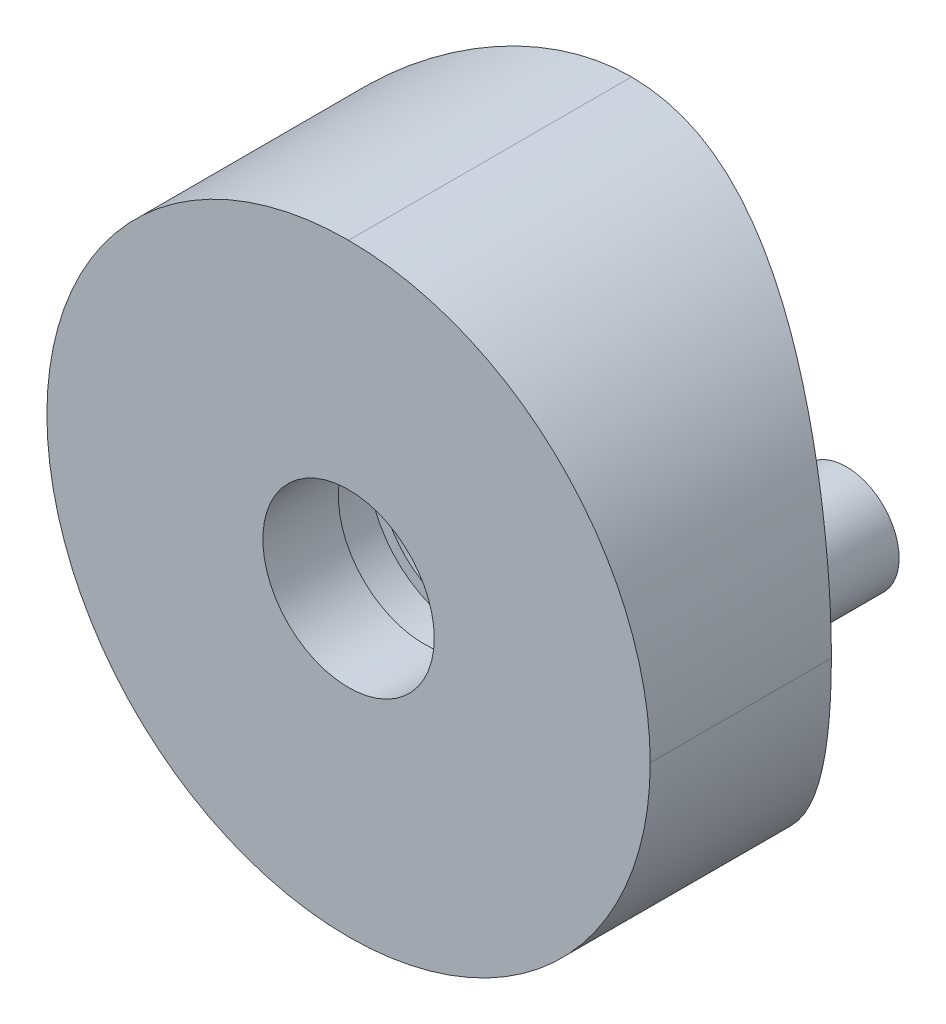
ISO-10303-21;
HEADER;
FILE_DESCRIPTION(('STEP AP214'),'2;1');
FILE_NAME('part.step','',(''),(''),'','','');
FILE_SCHEMA(('AUTOMOTIVE_DESIGN { 1 0 10303 214 1 1 1 1 }'));
ENDSEC;
DATA;
#1=APPLICATION_CONTEXT('core data for automotive mechanical design processes');
#2=APPLICATION_PROTOCOL_DEFINITION('international standard','automotive_design',2000,#1);
#3=PRODUCT_CONTEXT('',#1,'mechanical');
#4=PRODUCT('Part','Part','',(#3));
#5=PRODUCT_RELATED_PRODUCT_CATEGORY('part','',(#4));
#6=PRODUCT_DEFINITION_FORMATION('','',#4);
#7=PRODUCT_DEFINITION_CONTEXT('part definition',#1,'design');
#8=PRODUCT_DEFINITION('design','',#6,#7);
#9=PRODUCT_DEFINITION_SHAPE('','',#8);
#10=(LENGTH_UNIT() NAMED_UNIT(*) SI_UNIT(.MILLI.,.METRE.));
#11=(NAMED_UNIT(*) PLANE_ANGLE_UNIT() SI_UNIT($,.RADIAN.));
#12=(NAMED_UNIT(*) SI_UNIT($,.STERADIAN.) SOLID_ANGLE_UNIT());
#13=UNCERTAINTY_MEASURE_WITH_UNIT(LENGTH_MEASURE(1.E-05),#10,'distance_accuracy_value','');
#14=(GEOMETRIC_REPRESENTATION_CONTEXT(3) GLOBAL_UNCERTAINTY_ASSIGNED_CONTEXT((#13)) GLOBAL_UNIT_ASSIGNED_CONTEXT((#10,
#11,#12)) REPRESENTATION_CONTEXT('',''));
#15=CARTESIAN_POINT('',(0.,0.,0.));
#16=DIRECTION('',(0.,0.,1.));
#17=DIRECTION('',(1.,0.,0.));
#18=AXIS2_PLACEMENT_3D('',#15,#16,#17);
#19=CARTESIAN_POINT('',(10.,10.,-0.716442797975996));
#20=DIRECTION('',(0.,0.,1.));
#21=DIRECTION('',(1.,0.,0.));
#22=AXIS2_PLACEMENT_3D('',#19,#20,#21);
#23=CYLINDRICAL_SURFACE('',#22,2.8408);
#24=CARTESIAN_POINT('',(12.8408,10.,3.37559525159331));
#25=CARTESIAN_POINT('',(12.8407937226143,9.84168540236226,3.37559249060534));
#26=CARTESIAN_POINT('',(12.827521246579,9.683286342513,3.37329306931909));
#27=CARTESIAN_POINT('',(12.7748071547623,9.37093614337963,3.36434169520295));
#28=CARTESIAN_POINT('',(12.7353419752135,9.21698913956294,3.35768582324962));
#29=CARTESIAN_POINT('',(12.6314738061418,8.91810685294836,3.34076758668274));
#30=CARTESIAN_POINT('',(12.5670917571004,8.77316412122646,3.33050825113732));
#31=CARTESIAN_POINT('',(12.4152734521151,8.49615547255595,3.30750916669673));
#32=CARTESIAN_POINT('',(12.3278396360572,8.36408819484605,3.29476968034736));
#33=CARTESIAN_POINT('',(12.1314540035819,8.1152185734614,3.26807608274955));
#34=CARTESIAN_POINT('',(12.0223134580019,7.99856621529367,3.25411196569029));
#35=CARTESIAN_POINT('',(11.7860186481537,7.78513385117561,3.22661893897315));
#36=CARTESIAN_POINT('',(11.6588632096067,7.68835514167291,3.21309005775619));
#37=CARTESIAN_POINT('',(11.3891101955813,7.51681037334466,3.18790232770362));
#38=CARTESIAN_POINT('',(11.2464162985464,7.44219371613695,3.17625640181868));
#39=CARTESIAN_POINT('',(10.9502855606257,7.31804679485913,3.15629258333633));
#40=CARTESIAN_POINT('',(10.7968494965299,7.26851471899584,3.14797445039031));
#41=CARTESIAN_POINT('',(10.4851837266484,7.19641781409857,3.13570793396452));
#42=CARTESIAN_POINT('',(10.3270157661745,7.17359335773182,3.13171750876188));
#43=CARTESIAN_POINT('',(10.0090486356101,7.15475438931598,3.12843115666165));
#44=CARTESIAN_POINT('',(9.84924958962041,7.15873785255248,3.12913487523072));
#45=CARTESIAN_POINT('',(9.53441668679739,7.19319041464486,3.1351189410115));
#46=CARTESIAN_POINT('',(9.37934971451411,7.22336696280313,3.14034873457644));
#47=CARTESIAN_POINT('',(9.0765129951128,7.30888957314463,3.15471648341475));
#48=CARTESIAN_POINT('',(8.92874351375922,7.36423655125155,3.16385458090618));
#49=CARTESIAN_POINT('',(8.64382563156863,7.49882285449797,3.18506346898425));
#50=CARTESIAN_POINT('',(8.50673535536042,7.57818280956788,3.1971490052239));
#51=CARTESIAN_POINT('',(8.24770642691024,7.75845676943705,3.22288092631129));
#52=CARTESIAN_POINT('',(8.12576907906938,7.85937262779092,3.23652744533832));
#53=CARTESIAN_POINT('',(7.89881471817132,8.08148351319484,3.26406538107369));
#54=CARTESIAN_POINT('',(7.79404311274134,8.20292935230878,3.27795764798444));
#55=CARTESIAN_POINT('',(7.60632714074204,8.46180682679711,3.30425500275841));
#56=CARTESIAN_POINT('',(7.52338293289104,8.59923857840288,3.31666007980714));
#57=CARTESIAN_POINT('',(7.38165043311354,8.88642381994991,3.338604736382));
#58=CARTESIAN_POINT('',(7.32288479190731,9.03618870681201,3.34814162672296));
#59=CARTESIAN_POINT('',(7.23141044329033,9.34366371485915,3.36325400071333));
#60=CARTESIAN_POINT('',(7.19869940782554,9.501373124839,3.3688298382894));
#61=CARTESIAN_POINT('',(7.16059774671143,9.81814618827943,3.37534401080793));
#62=CARTESIAN_POINT('',(7.15487039371626,9.97716820495535,3.37633949988117));
#63=CARTESIAN_POINT('',(7.16999955395511,10.2938990363418,3.3737376898414));
#64=CARTESIAN_POINT('',(7.19085497315601,10.4516079048271,3.37014057974011));
#65=CARTESIAN_POINT('',(7.25827761167288,10.7601884921334,3.35879317963597));
#66=CARTESIAN_POINT('',(7.30467719111495,10.9110979214029,3.35106997780114));
#67=CARTESIAN_POINT('',(7.42169164388095,11.2029959497299,3.33233282749223));
#68=CARTESIAN_POINT('',(7.49230795180705,11.3439839604448,3.3213186840673));
#69=CARTESIAN_POINT('',(7.65651594929279,11.6134932065575,3.29707934934757));
#70=CARTESIAN_POINT('',(7.75031681969925,11.741885179189,3.28383439815261));
#71=CARTESIAN_POINT('',(7.95794473047761,11.9812263741873,3.25665985449636));
#72=CARTESIAN_POINT('',(8.07177332953946,12.0921742376648,3.24273020880847));
#73=CARTESIAN_POINT('',(8.31773945906854,12.2947339756983,3.21557019736711));
#74=CARTESIAN_POINT('',(8.45006605454838,12.3861177432863,3.20234930099221));
#75=CARTESIAN_POINT('',(8.72838982863142,12.545359454981,3.1782839290712));
#76=CARTESIAN_POINT('',(8.87438655313112,12.6132181802065,3.16743937462611));
#77=CARTESIAN_POINT('',(9.17528336462969,12.7231468409996,3.14942643602705));
#78=CARTESIAN_POINT('',(9.33014181382319,12.7653280341782,3.14224221450503));
#79=CARTESIAN_POINT('',(9.64488070482599,12.8230527441601,3.13232450243916));
#80=CARTESIAN_POINT('',(9.80476067626359,12.8385987483788,3.12959059628906));
#81=CARTESIAN_POINT('',(10.1227247102506,12.8425388723039,3.12890178552174));
#82=CARTESIAN_POINT('',(10.2808042984525,12.8312922175704,3.13088365321883));
#83=CARTESIAN_POINT('',(10.5927854932033,12.7827454948009,3.13926409981226));
#84=CARTESIAN_POINT('',(10.7466871159785,12.7454455279651,3.14566266155258));
#85=CARTESIAN_POINT('',(11.0457909681218,12.6459922128358,3.16213084542557));
#86=CARTESIAN_POINT('',(11.1910044413346,12.5838718226661,3.17219559779976));
#87=CARTESIAN_POINT('',(11.4690063369628,12.4365784778338,3.19486648364989));
#88=CARTESIAN_POINT('',(11.6017940751691,12.3514042547419,3.20747275695139));
#89=CARTESIAN_POINT('',(11.8529862217144,12.159147331611,3.23400568031942));
#90=CARTESIAN_POINT('',(11.9711873673398,12.0518010472521,3.24794701950855));
#91=CARTESIAN_POINT('',(12.1880208836436,11.8188016558649,3.27546395623096));
#92=CARTESIAN_POINT('',(12.2866487398597,11.6931443370695,3.28903946876598));
#93=CARTESIAN_POINT('',(12.4622091152544,11.4259787947863,3.31441232081151));
#94=CARTESIAN_POINT('',(12.5389752024211,11.2843598622275,3.32619571693462));
#95=CARTESIAN_POINT('',(12.6675078801968,10.9900878832752,3.34652099071827));
#96=CARTESIAN_POINT('',(12.719299013364,10.8374458394871,3.35506604887501));
#97=CARTESIAN_POINT('',(12.7853524241958,10.5702046170988,3.36611789185299));
#98=CARTESIAN_POINT('',(12.8061114088632,10.4572092037371,3.36965263660791));
#99=CARTESIAN_POINT('',(12.8338373402772,10.2294906339598,3.37439229497439));
#100=CARTESIAN_POINT('',(12.8408045506854,10.1147675106156,3.37559725312521));
#101=CARTESIAN_POINT('',(12.8408,10.,3.37559525159331));
#102=B_SPLINE_CURVE_WITH_KNOTS('',3,(#24,#25,#26,#27,#28,#29,#30,#31,#32,#33,#34,#35,#36,#37,
#38,#39,#40,#41,#42,#43,#44,#45,#46,#47,#48,#49,#50,#51,#52,#53,#54,#55,#56,#57,#58,#59,#60,#61,
#62,#63,#64,#65,#66,#67,#68,#69,#70,#71,#72,#73,#74,#75,#76,#77,#78,#79,#80,#81,#82,#83,#84,#85,
#86,#87,#88,#89,#90,#91,#92,#93,#94,#95,#96,#97,#98,#99,#100,#101),.UNSPECIFIED.,.T.,.F.,(4,2,2,
2,2,2,2,2,2,2,2,2,2,2,2,2,2,2,2,2,2,2,2,2,2,2,2,2,2,2,2,2,2,2,2,2,2,2,4),(0.,0.474524233965869,
0.949475944337956,1.42402936248474,1.89853257226252,2.37735747024881,2.85621359422431,
3.33822816276071,3.82020791168846,4.29746230539481,4.77468065404389,5.24663655028696,
5.71860962184959,6.19299417763015,6.66741954134614,7.14812646335039,7.62883688072741,
8.10999661260077,8.5911133466423,9.06621007043067,9.54128724190295,10.013283139847,
10.4853070037216,10.9617559421007,11.4382419772939,11.9200128018896,12.4017676283732,
12.8814199301799,13.3610274356258,13.8342408170883,14.307452360432,14.7800376208742,
15.2526488883977,15.731240408206,16.2099421843241,16.6921963930371,17.1739757262467,
17.5179806823907,17.86197906202),.UNSPECIFIED.);
#103=CARTESIAN_POINT('',(12.8408,10.,3.37559525159331));
#104=VERTEX_POINT('',#103);
#105=EDGE_CURVE('E172',#104,#104,#102,.T.);
#106=ORIENTED_EDGE('',*,*,#105,.T.);
#107=EDGE_LOOP('',(#106));
#108=FACE_BOUND('',#107,.T.);
#109=CARTESIAN_POINT('',(10.,10.,5.5));
#110=DIRECTION('',(0.,0.,1.));
#111=DIRECTION('',(1.,0.,0.));
#112=AXIS2_PLACEMENT_3D('',#109,#110,#111);
#113=CIRCLE('',#112,2.8408);
#114=CARTESIAN_POINT('',(12.8408,10.,5.5));
#115=VERTEX_POINT('',#114);
#116=EDGE_CURVE('E123',#115,#115,#113,.F.);
#117=ORIENTED_EDGE('',*,*,#116,.F.);
#118=EDGE_LOOP('',(#117));
#119=FACE_BOUND('',#118,.T.);
#120=ADVANCED_FACE('F43',(#108,#119),#23,.F.);
#121=CARTESIAN_POINT('',(20.,10.,-13.1244047484067));
#122=DIRECTION('',(-1.,0.,0.));
#123=DIRECTION('',(0.,0.,1.));
#124=AXIS2_PLACEMENT_3D('',#121,#122,#123);
#125=CYLINDRICAL_SURFACE('',#124,16.5);
#126=CARTESIAN_POINT('',(18.25,10.,3.37559525159331));
#127=CARTESIAN_POINT('',(18.2499957724702,10.098002960497,3.37559406292763));
#128=CARTESIAN_POINT('',(18.2417397760269,10.1960699278481,3.37471284249215));
#129=CARTESIAN_POINT('',(18.2089308843479,10.389482825218,3.37128222188373));
#130=CARTESIAN_POINT('',(18.184360242691,10.4848256741249,3.36873100519822));
#131=CARTESIAN_POINT('',(18.1196473479634,10.6699616868549,3.36224825037529));
#132=CARTESIAN_POINT('',(18.0795147401692,10.7597582483689,3.35831756737143));
#133=CARTESIAN_POINT('',(17.9848364075027,10.931321892655,3.34951487568451));
#134=CARTESIAN_POINT('',(17.9302934607001,11.0130905189143,3.34464304848676));
#135=CARTESIAN_POINT('',(17.8081074329629,11.1666252112754,3.33448148469945));
#136=CARTESIAN_POINT('',(17.740418133571,11.238354404386,3.32919031386033));
#137=CARTESIAN_POINT('',(17.5939596340758,11.3694570224552,3.31879820331352));
#138=CARTESIAN_POINT('',(17.5151899107053,11.4288298635631,3.31369727260421));
#139=CARTESIAN_POINT('',(17.3485735441721,11.5336666912129,3.30424868696048));
#140=CARTESIAN_POINT('',(17.2607056094435,11.5790970186838,3.29990286575321));
#141=CARTESIAN_POINT('',(17.0785344162877,11.6545442962299,3.2924746418376));
#142=CARTESIAN_POINT('',(16.9842313356417,11.6845616719175,3.28939220424273));
#143=CARTESIAN_POINT('',(16.7922445854527,11.7282209585861,3.28485292043581));
#144=CARTESIAN_POINT('',(16.6945750361591,11.7419243169763,3.28338997580828));
#145=CARTESIAN_POINT('',(16.4983122230523,11.7527565704961,3.28223645905347));
#146=CARTESIAN_POINT('',(16.3997189864501,11.7498859523562,3.28254583487818));
#147=CARTESIAN_POINT('',(16.2048321040548,11.7277023379337,3.28489643039813));
#148=CARTESIAN_POINT('',(16.1085307089603,11.7084565646093,3.28693056951213));
#149=CARTESIAN_POINT('',(15.9205324985704,11.6541736180071,3.29249044141474));
#150=CARTESIAN_POINT('',(15.8288357524718,11.6191362074974,3.29601619661128));
#151=CARTESIAN_POINT('',(15.6524382013937,11.5341908031848,3.30417016237355));
#152=CARTESIAN_POINT('',(15.5677517985818,11.4842531213462,3.30880057017632));
#153=CARTESIAN_POINT('',(15.4079365176731,11.3709460323202,3.31864029402868));
#154=CARTESIAN_POINT('',(15.3328079545296,11.3075761826947,3.32384962914469));
#155=CARTESIAN_POINT('',(15.1938504448651,11.1688287839835,3.33429178787553));
#156=CARTESIAN_POINT('',(15.1300794260505,11.0933932042263,3.33952459975732));
#157=CARTESIAN_POINT('',(15.0160966691166,10.9328568100131,3.34939974903612));
#158=CARTESIAN_POINT('',(14.9658849492316,10.8477559825597,3.35404208563906));
#159=CARTESIAN_POINT('',(14.8804479159192,10.67026364933,3.36221502439204));
#160=CARTESIAN_POINT('',(14.8452256943677,10.5778706440546,3.36574539713889));
#161=CARTESIAN_POINT('',(14.7908107237089,10.3884362531284,3.37129435966228));
#162=CARTESIAN_POINT('',(14.7716174351802,10.2913950240205,3.37331300031289));
#163=CARTESIAN_POINT('',(14.7498789990789,10.0959203091645,3.37560450146604));
#164=CARTESIAN_POINT('',(14.7472539464905,9.99749580371049,3.37588574093872));
#165=CARTESIAN_POINT('',(14.7585164066642,9.80160826523429,3.37469325392929));
#166=CARTESIAN_POINT('',(14.7724036679564,9.70414521759263,3.37321955417355));
#167=CARTESIAN_POINT('',(14.8162302351897,9.51317898540055,3.36868810732093));
#168=CARTESIAN_POINT('',(14.8461319748711,9.41966708399906,3.36563406789983));
#169=CARTESIAN_POINT('',(14.9210999926897,9.23898626115349,3.35828439573834));
#170=CARTESIAN_POINT('',(14.9661666507222,9.15181749867743,3.35398873189449));
#171=CARTESIAN_POINT('',(15.0703823153456,8.98593705432082,3.3446150546891));
#172=CARTESIAN_POINT('',(15.1295836408359,8.90725840766603,3.33953416007429));
#173=CARTESIAN_POINT('',(15.2603133397568,8.760926370643,3.32916897359169));
#174=CARTESIAN_POINT('',(15.3318420620309,8.69327329238417,3.32388467597123));
#175=CARTESIAN_POINT('',(15.4855455228627,8.570634019112,3.31368289968052));
#176=CARTESIAN_POINT('',(15.5677623190435,8.51570038499433,3.30876699796318));
#177=CARTESIAN_POINT('',(15.7403014070695,8.42042108524651,3.29988305957027));
#178=CARTESIAN_POINT('',(15.8306235761889,8.38007519878572,3.29591500854636));
#179=CARTESIAN_POINT('',(16.0166316176109,8.3152040187127,3.28938611948027));
#180=CARTESIAN_POINT('',(16.1123066101934,8.29064781727796,3.28682253370597));
#181=CARTESIAN_POINT('',(16.3064505317063,8.2579529389438,3.28338445807098));
#182=CARTESIAN_POINT('',(16.404919369459,8.24981372689665,3.28250991315235));
#183=CARTESIAN_POINT('',(16.6013333067862,8.2501918246678,3.28255020133643));
#184=CARTESIAN_POINT('',(16.699278577536,8.2586265695785,3.28345616465444));
#185=CARTESIAN_POINT('',(16.8923520375118,8.29173965053424,3.28693644339379));
#186=CARTESIAN_POINT('',(16.9874802241183,8.31641800168343,3.28951076036645));
#187=CARTESIAN_POINT('',(17.1722162302252,8.38129428615135,3.29603516315453));
#188=CARTESIAN_POINT('',(17.2618250346749,8.42148944109387,3.29998500266203));
#189=CARTESIAN_POINT('',(17.4330378125806,8.51624996761204,3.3088158835964));
#190=CARTESIAN_POINT('',(17.5146417982288,8.57081531729985,3.3136969236049));
#191=CARTESIAN_POINT('',(17.6679515327218,8.69307675842706,3.32386938190447));
#192=CARTESIAN_POINT('',(17.7396080594554,8.76083442005626,3.32916265177897));
#193=CARTESIAN_POINT('',(17.8705688325482,8.9074330497476,3.33954633932345));
#194=CARTESIAN_POINT('',(17.9298701273079,8.9862766586665,3.34463670828714));
#195=CARTESIAN_POINT('',(18.0345704678489,9.15305355518052,3.35405609738688));
#196=CARTESIAN_POINT('',(18.0799301937702,9.24101163238438,3.35838294979736));
#197=CARTESIAN_POINT('',(18.1551745766745,9.42328736827949,3.36576469889412));
#198=CARTESIAN_POINT('',(18.1850765419765,9.51759777977005,3.36882101746432));
#199=CARTESIAN_POINT('',(18.22116630663,9.67702694047212,3.37255625692655));
#200=CARTESIAN_POINT('',(18.2319640002903,9.7411293626899,3.37369051341382));
#201=CARTESIAN_POINT('',(18.2463822304952,9.87014515733547,3.37521040279057));
#202=CARTESIAN_POINT('',(18.2500028013646,9.9350585258834,3.37559603926035));
#203=CARTESIAN_POINT('',(18.25,10.,3.37559525159331));
#204=B_SPLINE_CURVE_WITH_KNOTS('',3,(#126,#127,#128,#129,#130,#131,#132,#133,#134,#135,#136,
#137,#138,#139,#140,#141,#142,#143,#144,#145,#146,#147,#148,#149,#150,#151,#152,#153,#154,#155,
#156,#157,#158,#159,#160,#161,#162,#163,#164,#165,#166,#167,#168,#169,#170,#171,#172,#173,#174,
#175,#176,#177,#178,#179,#180,#181,#182,#183,#184,#185,#186,#187,#188,#189,#190,#191,#192,#193,
#194,#195,#196,#197,#198,#199,#200,#201,#202,#203),.UNSPECIFIED.,.T.,.F.,(4,2,2,2,2,2,2,2,2,2,2,
2,2,2,2,2,2,2,2,2,2,2,2,2,2,2,2,2,2,2,2,2,2,2,2,2,2,2,4),(0.,0.293771724678603,
0.587863527185041,0.881773342762406,1.1756265387871,1.47053216903877,1.76545173073091,
2.06107776606963,2.35669563756537,2.65119649357738,2.94568870098193,3.23897776569862,
3.53227123653352,3.82615302694115,4.12004449893671,4.4153944857433,4.71074486973305,
5.0061561459999,5.30155748039671,5.59553306253054,5.88950416769961,6.18278868583037,
6.4760805515553,6.77047533134155,7.06487844334484,7.36047723703179,7.6560715557301,
7.95108548186762,8.24608979122454,8.5396282310129,8.83316694374895,9.12665312098934,
9.42013885121148,9.71502865300507,10.0099888218378,10.3057734004236,10.6012260626438,
10.7958942644937,10.9905615353359),.UNSPECIFIED.);
#205=CARTESIAN_POINT('',(18.25,10.,3.37559525159331));
#206=VERTEX_POINT('',#205);
#207=EDGE_CURVE('E48',#206,#206,#204,.T.);
#208=ORIENTED_EDGE('',*,*,#207,.T.);
#209=EDGE_LOOP('',(#208));
#210=FACE_BOUND('',#209,.T.);
#211=CARTESIAN_POINT('',(5.25,10.,3.37559525159331));
#212=CARTESIAN_POINT('',(5.24999577247015,10.098002960497,3.37559406292763));
#213=CARTESIAN_POINT('',(5.24173977602688,10.1960699278481,3.37471284249215));
#214=CARTESIAN_POINT('',(5.20893088434794,10.389482825218,3.37128222188373));
#215=CARTESIAN_POINT('',(5.18436024269104,10.4848256741249,3.36873100519822));
#216=CARTESIAN_POINT('',(5.11964734796336,10.6699616868549,3.36224825037529));
#217=CARTESIAN_POINT('',(5.07951474016917,10.7597582483689,3.35831756737143));
#218=CARTESIAN_POINT('',(4.98483640750265,10.931321892655,3.34951487568451));
#219=CARTESIAN_POINT('',(4.93029346070013,11.0130905189143,3.34464304848676));
#220=CARTESIAN_POINT('',(4.80810743296291,11.1666252112754,3.33448148469945));
#221=CARTESIAN_POINT('',(4.74041813357097,11.238354404386,3.32919031386033));
#222=CARTESIAN_POINT('',(4.59395963407576,11.3694570224552,3.31879820331352));
#223=CARTESIAN_POINT('',(4.51518991070532,11.4288298635631,3.31369727260421));
#224=CARTESIAN_POINT('',(4.34857354417208,11.5336666912129,3.30424868696048));
#225=CARTESIAN_POINT('',(4.26070560944349,11.5790970186838,3.29990286575321));
#226=CARTESIAN_POINT('',(4.07853441628766,11.6545442962299,3.2924746418376));
#227=CARTESIAN_POINT('',(3.98423133564174,11.6845616719175,3.28939220424273));
#228=CARTESIAN_POINT('',(3.79224458545271,11.7282209585861,3.28485292043581));
#229=CARTESIAN_POINT('',(3.69457503615912,11.7419243169763,3.28338997580828));
#230=CARTESIAN_POINT('',(3.49831222305234,11.7527565704961,3.28223645905347));
#231=CARTESIAN_POINT('',(3.39971898645011,11.7498859523562,3.28254583487818));
#232=CARTESIAN_POINT('',(3.20483210405483,11.7277023379337,3.28489643039813));
#233=CARTESIAN_POINT('',(3.10853070896032,11.7084565646093,3.28693056951213));
#234=CARTESIAN_POINT('',(2.92053249857036,11.6541736180071,3.29249044141474));
#235=CARTESIAN_POINT('',(2.82883575247181,11.6191362074974,3.29601619661128));
#236=CARTESIAN_POINT('',(2.65243820139366,11.5341908031848,3.30417016237355));
#237=CARTESIAN_POINT('',(2.56775179858178,11.4842531213462,3.30880057017632));
#238=CARTESIAN_POINT('',(2.40793651767313,11.3709460323202,3.31864029402868));
#239=CARTESIAN_POINT('',(2.3328079545296,11.3075761826947,3.32384962914469));
#240=CARTESIAN_POINT('',(2.19385044486505,11.1688287839835,3.33429178787553));
#241=CARTESIAN_POINT('',(2.13007942605053,11.0933932042263,3.33952459975732));
#242=CARTESIAN_POINT('',(2.01609666911658,10.9328568100131,3.34939974903612));
#243=CARTESIAN_POINT('',(1.96588494923163,10.8477559825597,3.35404208563906));
#244=CARTESIAN_POINT('',(1.88044791591915,10.67026364933,3.36221502439204));
#245=CARTESIAN_POINT('',(1.84522569436767,10.5778706440546,3.36574539713889));
#246=CARTESIAN_POINT('',(1.79081072370888,10.3884362531284,3.37129435966228));
#247=CARTESIAN_POINT('',(1.77161743518022,10.2913950240205,3.37331300031289));
#248=CARTESIAN_POINT('',(1.74987899907893,10.0959203091645,3.37560450146604));
#249=CARTESIAN_POINT('',(1.74725394649053,9.99749580371049,3.37588574093872));
#250=CARTESIAN_POINT('',(1.75851640666417,9.80160826523429,3.37469325392929));
#251=CARTESIAN_POINT('',(1.77240366795636,9.70414521759263,3.37321955417355));
#252=CARTESIAN_POINT('',(1.81623023518973,9.51317898540055,3.36868810732093));
#253=CARTESIAN_POINT('',(1.84613197487107,9.41966708399905,3.36563406789983));
#254=CARTESIAN_POINT('',(1.92109999268974,9.23898626115349,3.35828439573834));
#255=CARTESIAN_POINT('',(1.96616665072223,9.15181749867743,3.35398873189449));
#256=CARTESIAN_POINT('',(2.07038231534563,8.98593705432082,3.3446150546891));
#257=CARTESIAN_POINT('',(2.12958364083587,8.90725840766603,3.33953416007429));
#258=CARTESIAN_POINT('',(2.26031333975681,8.760926370643,3.32916897359169));
#259=CARTESIAN_POINT('',(2.33184206203091,8.69327329238417,3.32388467597123));
#260=CARTESIAN_POINT('',(2.4855455228627,8.57063401911199,3.31368289968052));
#261=CARTESIAN_POINT('',(2.56776231904354,8.51570038499432,3.30876699796318));
#262=CARTESIAN_POINT('',(2.74030140706951,8.42042108524651,3.29988305957027));
#263=CARTESIAN_POINT('',(2.83062357618894,8.38007519878572,3.29591500854636));
#264=CARTESIAN_POINT('',(3.01663161761089,8.3152040187127,3.28938611948027));
#265=CARTESIAN_POINT('',(3.11230661019342,8.29064781727796,3.28682253370597));
#266=CARTESIAN_POINT('',(3.30645053170631,8.2579529389438,3.28338445807098));
#267=CARTESIAN_POINT('',(3.40491936945905,8.24981372689665,3.28250991315235));
#268=CARTESIAN_POINT('',(3.60133330678622,8.2501918246678,3.28255020133643));
#269=CARTESIAN_POINT('',(3.69927857753598,8.25862656957851,3.28345616465444));
#270=CARTESIAN_POINT('',(3.89235203751181,8.29173965053425,3.28693644339379));
#271=CARTESIAN_POINT('',(3.98748022411832,8.31641800168343,3.28951076036646));
#272=CARTESIAN_POINT('',(4.17221623022517,8.38129428615135,3.29603516315453));
#273=CARTESIAN_POINT('',(4.26182503467494,8.42148944109387,3.29998500266203));
#274=CARTESIAN_POINT('',(4.43303781258064,8.51624996761204,3.30881588359639));
#275=CARTESIAN_POINT('',(4.51464179822877,8.57081531729985,3.3136969236049));
#276=CARTESIAN_POINT('',(4.66795153272179,8.69307675842706,3.32386938190447));
#277=CARTESIAN_POINT('',(4.73960805945544,8.76083442005626,3.32916265177897));
#278=CARTESIAN_POINT('',(4.87056883254824,8.9074330497476,3.33954633932345));
#279=CARTESIAN_POINT('',(4.92987012730791,8.98627665866651,3.34463670828714));
#280=CARTESIAN_POINT('',(5.03457046784888,9.15305355518053,3.35405609738688));
#281=CARTESIAN_POINT('',(5.0799301937702,9.24101163238438,3.35838294979736));
#282=CARTESIAN_POINT('',(5.15517457667446,9.42328736827949,3.36576469889413));
#283=CARTESIAN_POINT('',(5.18507654197651,9.51759777977005,3.36882101746432));
#284=CARTESIAN_POINT('',(5.22116630662998,9.67702694047213,3.37255625692655));
#285=CARTESIAN_POINT('',(5.23196400029025,9.7411293626899,3.37369051341381));
#286=CARTESIAN_POINT('',(5.24638223049516,9.87014515733547,3.37521040279057));
#287=CARTESIAN_POINT('',(5.25000280136456,9.9350585258834,3.37559603926035));
#288=CARTESIAN_POINT('',(5.25,10.,3.37559525159331));
#289=B_SPLINE_CURVE_WITH_KNOTS('',3,(#211,#212,#213,#214,#215,#216,#217,#218,#219,#220,#221,
#222,#223,#224,#225,#226,#227,#228,#229,#230,#231,#232,#233,#234,#235,#236,#237,#238,#239,#240,
#241,#242,#243,#244,#245,#246,#247,#248,#249,#250,#251,#252,#253,#254,#255,#256,#257,#258,#259,
#260,#261,#262,#263,#264,#265,#266,#267,#268,#269,#270,#271,#272,#273,#274,#275,#276,#277,#278,
#279,#280,#281,#282,#283,#284,#285,#286,#287,#288),.UNSPECIFIED.,.T.,.F.,(4,2,2,2,2,2,2,2,2,2,2,
2,2,2,2,2,2,2,2,2,2,2,2,2,2,2,2,2,2,2,2,2,2,2,2,2,2,2,4),(0.,0.293771724678604,
0.587863527185041,0.881773342762404,1.1756265387871,1.47053216903877,1.76545173073091,
2.06107776606964,2.35669563756537,2.65119649357739,2.94568870098193,3.23897776569862,
3.53227123653352,3.82615302694116,4.12004449893671,4.41539448574331,4.71074486973305,
5.0061561459999,5.30155748039671,5.59553306253054,5.88950416769962,6.18278868583037,
6.4760805515553,6.77047533134155,7.06487844334484,7.36047723703179,7.65607155573011,
7.95108548186762,8.24608979122454,8.53962823101291,8.83316694374895,9.12665312098934,
9.42013885121149,9.71502865300508,10.0099888218378,10.3057734004236,10.6012260626438,
10.7958942644937,10.9905615353359),.UNSPECIFIED.);
#290=CARTESIAN_POINT('',(5.25,10.,3.37559525159331));
#291=VERTEX_POINT('',#290);
#292=EDGE_CURVE('E132',#291,#291,#289,.T.);
#293=ORIENTED_EDGE('',*,*,#292,.T.);
#294=EDGE_LOOP('',(#293));
#295=FACE_BOUND('',#294,.T.);
#296=ORIENTED_EDGE('',*,*,#105,.F.);
#297=EDGE_LOOP('',(#296));
#298=FACE_BOUND('',#297,.T.);
#299=CARTESIAN_POINT('',(10.,20.,0.));
#300=CARTESIAN_POINT('',(10.1261539378824,20.0000015530256,-4.49024586394061E-06));
#301=CARTESIAN_POINT('',(10.2522882469376,19.9976121705124,0.00181976854198663));
#302=CARTESIAN_POINT('',(10.5042637446295,19.9880734340493,0.00908076584781311));
#303=CARTESIAN_POINT('',(10.6301049537049,19.9809244226209,0.0145172444163603));
#304=CARTESIAN_POINT('',(11.0065221432699,19.9523940181859,0.0361598769014192));
#305=CARTESIAN_POINT('',(11.2563076240504,19.9239291357606,0.0576994514353225));
#306=CARTESIAN_POINT('',(11.7494580644437,19.8489152768967,0.113835948095202));
#307=CARTESIAN_POINT('',(11.9928589674974,19.8025172314448,0.148323825778746));
#308=CARTESIAN_POINT('',(12.4737471000633,19.6923392758946,0.228992376717918));
#309=CARTESIAN_POINT('',(12.7112330906346,19.6285557570918,0.275175477410885));
#310=CARTESIAN_POINT('',(13.1779913088461,19.484712850757,0.37737118884553));
#311=CARTESIAN_POINT('',(13.4072915520103,19.404716841563,0.433345410643463));
#312=CARTESIAN_POINT('',(13.8575545556569,19.2291773040249,0.553446590903484));
#313=CARTESIAN_POINT('',(14.0785175800986,19.1336342684151,0.617573290973801));
#314=CARTESIAN_POINT('',(14.7288152758161,18.8243327132243,0.819831759076929));
#315=CARTESIAN_POINT('',(15.1447995072908,18.5881388571977,0.967665451099689));
#316=CARTESIAN_POINT('',(15.7622811973456,18.1772575023367,1.20779406824237));
#317=CARTESIAN_POINT('',(15.9779821788299,18.0208820484018,1.29608476028671));
#318=CARTESIAN_POINT('',(16.395915786616,17.6917450117375,1.47429509866626));
#319=CARTESIAN_POINT('',(16.598147493885,17.5189823128227,1.56421485562411));
#320=CARTESIAN_POINT('',(16.9884313032264,17.1576956711134,1.74361827465836));
#321=CARTESIAN_POINT('',(17.1764750201693,16.9691625446112,1.83310165006335));
#322=CARTESIAN_POINT('',(17.537395208501,16.5771293061898,2.00958228728216));
#323=CARTESIAN_POINT('',(17.7102764325657,16.3736339212148,2.09658032231786));
#324=CARTESIAN_POINT('',(18.0585213518665,15.9286389019338,2.27575858390772));
#325=CARTESIAN_POINT('',(18.2319844301702,15.6854375483013,2.36742395156367));
#326=CARTESIAN_POINT('',(18.5575942384769,15.1824071380966,2.54287359709364));
#327=CARTESIAN_POINT('',(18.7097384158744,14.9225760957953,2.62665693082318));
#328=CARTESIAN_POINT('',(18.9907680908683,14.388281533116,2.78378072927428));
#329=CARTESIAN_POINT('',(19.1196985550257,14.1138476657183,2.85714132410122));
#330=CARTESIAN_POINT('',(19.3529291597184,13.551791599346,2.99136954531665));
#331=CARTESIAN_POINT('',(19.4572357343605,13.2641728690229,3.0522404346615));
#332=CARTESIAN_POINT('',(19.6221820506506,12.7340965498343,3.14928098051557));
#333=CARTESIAN_POINT('',(19.6873564803232,12.493497892705,3.18794776352476));
#334=CARTESIAN_POINT('',(19.7997555614635,12.0067759078392,3.25494712675014));
#335=CARTESIAN_POINT('',(19.8469845529797,11.7606539311694,3.28328220558995));
#336=CARTESIAN_POINT('',(19.923104581554,11.2631809081226,3.32907724058185));
#337=CARTESIAN_POINT('',(19.9518956732871,11.0118088641475,3.34647791582174));
#338=CARTESIAN_POINT('',(19.9807341227282,10.6332464821405,3.36392457133535));
#339=CARTESIAN_POINT('',(19.9879555896414,10.5067531734722,3.36829774695411));
#340=CARTESIAN_POINT('',(19.9975890980547,10.2535122644549,3.37413396453431));
#341=CARTESIAN_POINT('',(20.0000009738852,10.1267646554968,3.37559690625078));
#342=CARTESIAN_POINT('',(20.,10.,3.37559525159331));
#343=B_SPLINE_CURVE_WITH_KNOTS('',3,(#299,#300,#301,#302,#303,#304,#305,#306,#307,#308,#309,
#310,#311,#312,#313,#314,#315,#316,#317,#318,#319,#320,#321,#322,#323,#324,#325,#326,#327,#328,
#329,#330,#331,#332,#333,#334,#335,#336,#337,#338,#339,#340,#341,#342),.UNSPECIFIED.,.F.,.F.,(4,
2,2,2,2,2,2,2,2,2,2,2,2,2,2,2,2,2,2,2,2,4),(0.,0.378387490803095,0.756747754314857,
1.51252431160479,2.26207386664286,3.01177912439873,3.75860826516183,4.50541374116824,
6.00144442666341,6.84283704546802,7.68428701530801,8.52623045042825,9.36790902851181,
10.3040882676241,11.2403795039738,12.1748370957639,13.1090502472365,13.8649429339863,
14.6206526938974,15.3804249689864,15.7606407004937,16.1408695285618),.UNSPECIFIED.);
#344=CARTESIAN_POINT('',(10.,20.,0.));
#345=VERTEX_POINT('',#344);
#346=CARTESIAN_POINT('',(20.,10.,3.37559525159331));
#347=VERTEX_POINT('',#346);
#348=EDGE_CURVE('E104',#345,#347,#343,.T.);
#349=ORIENTED_EDGE('',*,*,#348,.T.);
#350=CARTESIAN_POINT('',(20.,10.,3.37559525159331));
#351=CARTESIAN_POINT('',(20.0000009777966,9.87164684114944,3.37559695900619));
#352=CARTESIAN_POINT('',(19.997528264952,9.74331153568389,3.37409708718413));
#353=CARTESIAN_POINT('',(19.9876521240842,9.48690614595938,3.36811393951672));
#354=CARTESIAN_POINT('',(19.9802489183026,9.35883605000712,3.36363079814205));
#355=CARTESIAN_POINT('',(19.9506828254144,8.97553975597609,3.34574472832081));
#356=CARTESIAN_POINT('',(19.9211634097964,8.72103681507562,3.3279050951521));
#357=CARTESIAN_POINT('',(19.8431378098089,8.21752578903354,3.2809725236252));
#358=CARTESIAN_POINT('',(19.7947382171349,7.96849500455489,3.25194277195568));
#359=CARTESIAN_POINT('',(19.6795792644698,7.47618298418777,3.18332705704396));
#360=CARTESIAN_POINT('',(19.6128183579043,7.23290223450031,3.14374020458521));
#361=CARTESIAN_POINT('',(19.4618875760207,6.75414560176024,3.05501425096154));
#362=CARTESIAN_POINT('',(19.3777514725619,6.51865559110212,3.00589369127343));
#363=CARTESIAN_POINT('',(19.1928532092641,6.05620860103433,2.89910464627917));
#364=CARTESIAN_POINT('',(19.0920846031934,5.82925497209648,2.84143284766803));
#365=CARTESIAN_POINT('',(18.8748053992904,5.38491190445616,2.71870508165305));
#366=CARTESIAN_POINT('',(18.7582844258211,5.16752889582374,2.65364425185937));
#367=CARTESIAN_POINT('',(18.5104274445313,4.74328925662903,2.51741909735726));
#368=CARTESIAN_POINT('',(18.3790859631042,4.53643655638817,2.44625251997532));
#369=CARTESIAN_POINT('',(18.0919239729706,4.11868887473933,2.29355020792079));
#370=CARTESIAN_POINT('',(17.9350003002196,3.90868997049609,2.21163762113707));
#371=CARTESIAN_POINT('',(17.6060040909912,3.50253794827238,2.04402497202737));
#372=CARTESIAN_POINT('',(17.433930973788,3.30638536158444,1.9583247645728));
#373=CARTESIAN_POINT('',(17.0752491027234,2.92830702714169,1.78480309586748));
#374=CARTESIAN_POINT('',(16.888620898226,2.74640099114979,1.69697890816406));
#375=CARTESIAN_POINT('',(16.5017829785403,2.39772192205654,1.52119169110047));
#376=CARTESIAN_POINT('',(16.3015726802731,2.23094953936166,1.4332286559381));
#377=CARTESIAN_POINT('',(15.8620148323332,1.89302353804593,1.24808963676514));
#378=CARTESIAN_POINT('',(15.6209234705293,1.72399500985305,1.15115947388048));
#379=CARTESIAN_POINT('',(15.1232242061294,1.40700114573377,0.962624516205757));
#380=CARTESIAN_POINT('',(14.8666139920111,1.25903895868818,0.871020518749743));
#381=CARTESIAN_POINT('',(14.3397606208469,0.985886628389826,0.696663882921372));
#382=CARTESIAN_POINT('',(14.0695631448701,0.860625947771656,0.613884168064816));
#383=CARTESIAN_POINT('',(13.5161527416957,0.633782612827251,0.460246979690515));
#384=CARTESIAN_POINT('',(13.2329434843497,0.53219333068946,0.389386170519086));
#385=CARTESIAN_POINT('',(12.710366077374,0.371200346633269,0.274999196814625));
#386=CARTESIAN_POINT('',(12.4729102569405,0.307447740320419,0.228837414127453));
#387=CARTESIAN_POINT('',(11.9921118603391,0.197332909625471,0.148213121837292));
#388=CARTESIAN_POINT('',(11.7487713815965,0.15096458357431,0.113746507777676));
#389=CARTESIAN_POINT('',(11.2558010761837,0.0760096558428758,0.0576531701748067));
#390=CARTESIAN_POINT('',(11.0061362848201,0.0475700221764734,0.0361326343375096));
#391=CARTESIAN_POINT('',(10.6298846351606,0.0190622490348865,0.014507118161413));
#392=CARTESIAN_POINT('',(10.5040874720891,0.011918237333784,0.00907443165743971));
#393=CARTESIAN_POINT('',(10.2522000547558,0.00238614862482553,0.00181848473151656));
#394=CARTESIAN_POINT('',(10.1261097793719,-1.57428740276227E-06,-4.50695623838881E-06));
#395=CARTESIAN_POINT('',(10.,0.,0.));
#396=B_SPLINE_CURVE_WITH_KNOTS('',3,(#350,#351,#352,#353,#354,#355,#356,#357,#358,#359,#360,
#361,#362,#363,#364,#365,#366,#367,#368,#369,#370,#371,#372,#373,#374,#375,#376,#377,#378,#379,
#380,#381,#382,#383,#384,#385,#386,#387,#388,#389,#390,#391,#392,#393,#394,#395),.UNSPECIFIED.,
.F.,.F.,(4,2,2,2,2,2,2,2,2,2,2,2,2,2,2,2,2,2,2,2,2,2,4),(0.,0.384991550198758,0.769965748102389,
1.53934402072772,2.30444006061036,3.06960056431511,3.83328760547631,4.59727132557218,
5.361760734354,6.12653341923325,6.94966578729483,7.77282972235051,8.59711318590729,
9.42143205833854,10.3502577061383,11.2792220442563,12.2052485068377,13.1310153766544,
13.8806214579648,14.6299641898796,15.3853723046959,15.7635994487837,16.1418547500291),.UNSPECIFIED.);
#397=CARTESIAN_POINT('',(10.,0.,0.));
#398=VERTEX_POINT('',#397);
#399=EDGE_CURVE('E99',#347,#398,#396,.T.);
#400=ORIENTED_EDGE('',*,*,#399,.T.);
#401=CARTESIAN_POINT('',(10.,0.,0.));
#402=CARTESIAN_POINT('',(9.87384606211761,-1.55302563657101E-06,-4.49024586052296E-06));
#403=CARTESIAN_POINT('',(9.74771175306241,0.00238782948760562,0.00181976854199066));
#404=CARTESIAN_POINT('',(9.49573625537051,0.0119265659506714,0.00908076584781624));
#405=CARTESIAN_POINT('',(9.3698950462951,0.0190755773791026,0.0145172444163619));
#406=CARTESIAN_POINT('',(8.99347785673007,0.0476059818140624,0.0361598769014183));
#407=CARTESIAN_POINT('',(8.74369237594964,0.0760708642393743,0.0576994514353227));
#408=CARTESIAN_POINT('',(8.25054193555634,0.151084723103306,0.113835948095202));
#409=CARTESIAN_POINT('',(8.00714103250259,0.197482768555199,0.148323825778744));
#410=CARTESIAN_POINT('',(7.52625289993669,0.307660724105404,0.228992376717919));
#411=CARTESIAN_POINT('',(7.2887669093654,0.371444242908246,0.275175477410889));
#412=CARTESIAN_POINT('',(6.82200869115395,0.515287149242953,0.377371188845533));
#413=CARTESIAN_POINT('',(6.59270844798969,0.59528315843705,0.433345410643462));
#414=CARTESIAN_POINT('',(6.14244544434309,0.770822695975133,0.553446590903481));
#415=CARTESIAN_POINT('',(5.92148241990138,0.866365731584939,0.617573290973802));
#416=CARTESIAN_POINT('',(5.27118472418392,1.17566728677571,0.819831759076932));
#417=CARTESIAN_POINT('',(4.8552004927092,1.41186114280229,0.967665451099687));
#418=CARTESIAN_POINT('',(4.23771880265439,1.82274249766334,1.20779406824237));
#419=CARTESIAN_POINT('',(4.02201782117009,1.97911795159817,1.29608476028671));
#420=CARTESIAN_POINT('',(3.60408421338403,2.30825498826246,1.47429509866626));
#421=CARTESIAN_POINT('',(3.40185250611498,2.48101768717732,1.56421485562411));
#422=CARTESIAN_POINT('',(3.0115686967736,2.84230432888658,1.74361827465835));
#423=CARTESIAN_POINT('',(2.82352497983066,3.0308374553888,1.83310165006335));
#424=CARTESIAN_POINT('',(2.46260479149896,3.42287069381021,2.00958228728216));
#425=CARTESIAN_POINT('',(2.28972356743433,3.62636607878518,2.09658032231786));
#426=CARTESIAN_POINT('',(1.94147864813351,4.07136109806618,2.27575858390772));
#427=CARTESIAN_POINT('',(1.76801556982977,4.31456245169868,2.36742395156367));
#428=CARTESIAN_POINT('',(1.44240576152306,4.81759286190345,2.54287359709364));
#429=CARTESIAN_POINT('',(1.29026158412559,5.07742390420473,2.62665693082318));
#430=CARTESIAN_POINT('',(1.0092319091317,5.61171846688397,2.78378072927428));
#431=CARTESIAN_POINT('',(0.880301444974282,5.88615233428165,2.85714132410122));
#432=CARTESIAN_POINT('',(0.647070840281641,6.44820840065401,2.99136954531665));
#433=CARTESIAN_POINT('',(0.542764265639499,6.73582713097711,3.0522404346615));
#434=CARTESIAN_POINT('',(0.37781794934944,7.26590345016569,3.14928098051557));
#435=CARTESIAN_POINT('',(0.312643519676754,7.50650210729499,3.18794776352476));
#436=CARTESIAN_POINT('',(0.200244438536475,7.9932240921608,3.25494712675013));
#437=CARTESIAN_POINT('',(0.15301544702027,8.23934606883057,3.28328220558995));
#438=CARTESIAN_POINT('',(0.0768954184460048,8.73681909187736,3.32907724058185));
#439=CARTESIAN_POINT('',(0.048104326712891,8.98819113585247,3.34647791582174));
#440=CARTESIAN_POINT('',(0.0192658772718106,9.36675351785946,3.36392457133535));
#441=CARTESIAN_POINT('',(0.0120444103586132,9.49324682652778,3.36829774695411));
#442=CARTESIAN_POINT('',(0.0024109019453275,9.74648773554513,3.37413396453431));
#443=CARTESIAN_POINT('',(-9.73885154534855E-07,9.87323534450317,3.37559690625078));
#444=CARTESIAN_POINT('',(0.,10.,3.37559525159331));
#445=B_SPLINE_CURVE_WITH_KNOTS('',3,(#401,#402,#403,#404,#405,#406,#407,#408,#409,#410,#411,
#412,#413,#414,#415,#416,#417,#418,#419,#420,#421,#422,#423,#424,#425,#426,#427,#428,#429,#430,
#431,#432,#433,#434,#435,#436,#437,#438,#439,#440,#441,#442,#443,#444),.UNSPECIFIED.,.F.,.F.,(4,
2,2,2,2,2,2,2,2,2,2,2,2,2,2,2,2,2,2,2,2,4),(0.,0.378387490803095,0.756747754314857,
1.51252431160479,2.26207386664286,3.01177912439873,3.75860826516183,4.50541374116824,
6.0014444266634,6.84283704546802,7.684287015308,8.52623045042825,9.36790902851181,
10.3040882676241,11.2403795039738,12.1748370957639,13.1090502472365,13.8649429339863,
14.6206526938974,15.3804249689864,15.7606407004937,16.1408695285618),.UNSPECIFIED.);
#446=CARTESIAN_POINT('',(0.,10.,3.37559525159331));
#447=VERTEX_POINT('',#446);
#448=EDGE_CURVE('E94',#398,#447,#445,.T.);
#449=ORIENTED_EDGE('',*,*,#448,.T.);
#450=CARTESIAN_POINT('',(0.,10.,3.37559525159331));
#451=CARTESIAN_POINT('',(-9.77796619329723E-07,10.1283531588506,3.37559695900619));
#452=CARTESIAN_POINT('',(0.00247173504795932,10.2566884643161,3.37409708718413));
#453=CARTESIAN_POINT('',(0.0123478759158084,10.5130938540406,3.36811393951672));
#454=CARTESIAN_POINT('',(0.0197510816974247,10.6411639499929,3.36363079814205));
#455=CARTESIAN_POINT('',(0.0493171745856148,11.0244602440239,3.34574472832081));
#456=CARTESIAN_POINT('',(0.0788365902035887,11.2789631849244,3.3279050951521));
#457=CARTESIAN_POINT('',(0.156862190191058,11.7824742109665,3.28097252362521));
#458=CARTESIAN_POINT('',(0.205261782865074,12.0315049954451,3.25194277195568));
#459=CARTESIAN_POINT('',(0.320420735530217,12.5238170158122,3.18332705704396));
#460=CARTESIAN_POINT('',(0.387181642095674,12.7670977654997,3.14374020458521));
#461=CARTESIAN_POINT('',(0.53811242397935,13.2458543982398,3.05501425096154));
#462=CARTESIAN_POINT('',(0.622248527438108,13.4813444088979,3.00589369127343));
#463=CARTESIAN_POINT('',(0.807146790735871,13.9437913989657,2.89910464627918));
#464=CARTESIAN_POINT('',(0.907915396806595,14.1707450279035,2.84143284766803));
#465=CARTESIAN_POINT('',(1.12519460070959,14.6150880955438,2.71870508165304));
#466=CARTESIAN_POINT('',(1.24171557417893,14.8324711041763,2.65364425185937));
#467=CARTESIAN_POINT('',(1.48957255546866,15.256710743371,2.51741909735727));
#468=CARTESIAN_POINT('',(1.62091403689579,15.4635634436118,2.44625251997532));
#469=CARTESIAN_POINT('',(1.90807602702942,15.8813111252607,2.29355020792079));
#470=CARTESIAN_POINT('',(2.06499969978036,16.0913100295039,2.21163762113707));
#471=CARTESIAN_POINT('',(2.39399590900881,16.4974620517276,2.04402497202737));
#472=CARTESIAN_POINT('',(2.56606902621202,16.6936146384156,1.9583247645728));
#473=CARTESIAN_POINT('',(2.92475089727657,17.0716929728583,1.78480309586748));
#474=CARTESIAN_POINT('',(3.11137910177396,17.2535990088502,1.69697890816406));
#475=CARTESIAN_POINT('',(3.49821702145975,17.6022780779435,1.52119169110047));
#476=CARTESIAN_POINT('',(3.69842731972685,17.7690504606383,1.4332286559381));
#477=CARTESIAN_POINT('',(4.13798516766679,18.1069764619541,1.24808963676514));
#478=CARTESIAN_POINT('',(4.37907652947069,18.276004990147,1.15115947388048));
#479=CARTESIAN_POINT('',(4.87677579387057,18.5929988542662,0.962624516205756));
#480=CARTESIAN_POINT('',(5.13338600798889,18.7409610413118,0.871020518749742));
#481=CARTESIAN_POINT('',(5.66023937915307,19.0141133716102,0.696663882921372));
#482=CARTESIAN_POINT('',(5.93043685512992,19.1393740522283,0.613884168064815));
#483=CARTESIAN_POINT('',(6.48384725830433,19.3662173871727,0.460246979690514));
#484=CARTESIAN_POINT('',(6.76705651565032,19.4678066693105,0.389386170519085));
#485=CARTESIAN_POINT('',(7.28963392262599,19.6287996533667,0.274999196814625));
#486=CARTESIAN_POINT('',(7.52708974305947,19.6925522596796,0.228837414127453));
#487=CARTESIAN_POINT('',(8.00788813966087,19.8026670903745,0.148213121837292));
#488=CARTESIAN_POINT('',(8.25122861840347,19.8490354164257,0.113746507777676));
#489=CARTESIAN_POINT('',(8.74419892381632,19.9239903441571,0.0576531701748074));
#490=CARTESIAN_POINT('',(8.99386371517992,19.9524299778235,0.0361326343375113));
#491=CARTESIAN_POINT('',(9.37011536483937,19.9809377509651,0.0145071181614121));
#492=CARTESIAN_POINT('',(9.49591252791088,19.9880817626662,0.00907443165743715));
#493=CARTESIAN_POINT('',(9.74779994524422,19.9976138513752,0.00181848473151257));
#494=CARTESIAN_POINT('',(9.87389022062808,20.0000015742874,-4.50695624222885E-06));
#495=CARTESIAN_POINT('',(10.,20.,0.));
#496=B_SPLINE_CURVE_WITH_KNOTS('',3,(#450,#451,#452,#453,#454,#455,#456,#457,#458,#459,#460,
#461,#462,#463,#464,#465,#466,#467,#468,#469,#470,#471,#472,#473,#474,#475,#476,#477,#478,#479,
#480,#481,#482,#483,#484,#485,#486,#487,#488,#489,#490,#491,#492,#493,#494,#495),.UNSPECIFIED.,
.F.,.F.,(4,2,2,2,2,2,2,2,2,2,2,2,2,2,2,2,2,2,2,2,2,2,4),(0.,0.38499155019876,0.76996574810239,
1.53934402072772,2.30444006061036,3.06960056431511,3.83328760547631,4.59727132557217,
5.361760734354,6.12653341923325,6.94966578729483,7.77282972235051,8.59711318590728,
9.42143205833854,10.3502577061383,11.2792220442563,12.2052485068377,13.1310153766544,
13.8806214579648,14.6299641898796,15.3853723046959,15.7635994487837,16.1418547500291),.UNSPECIFIED.);
#497=EDGE_CURVE('E97',#447,#345,#496,.T.);
#498=ORIENTED_EDGE('',*,*,#497,.T.);
#499=EDGE_LOOP('',(#349,#400,#449,#498));
#500=FACE_BOUND('',#499,.T.);
#501=ADVANCED_FACE('F96',(#210,#295,#298,#500),#125,.F.);
#502=CARTESIAN_POINT('',(20.,20.,9.38));
#503=DIRECTION('',(0.,0.,-1.));
#504=DIRECTION('',(0.,1.,0.));
#505=AXIS2_PLACEMENT_3D('',#502,#503,#504);
#506=PLANE('',#505);
#507=CARTESIAN_POINT('',(10.,10.,9.38));
#508=DIRECTION('',(0.,0.,1.));
#509=DIRECTION('',(1.,0.,0.));
#510=AXIS2_PLACEMENT_3D('',#507,#508,#509);
#511=CIRCLE('',#510,2.8408);
#512=CARTESIAN_POINT('',(12.8408,10.,9.38));
#513=VERTEX_POINT('',#512);
#514=EDGE_CURVE('E131',#513,#513,#511,.T.);
#515=ORIENTED_EDGE('',*,*,#514,.F.);
#516=EDGE_LOOP('',(#515));
#517=FACE_BOUND('',#516,.T.);
#518=CARTESIAN_POINT('',(10.,10.,9.38));
#519=DIRECTION('',(0.,0.,-1.));
#520=DIRECTION('',(0.,1.,0.));
#521=AXIS2_PLACEMENT_3D('',#518,#519,#520);
#522=CIRCLE('',#521,10.);
#523=CARTESIAN_POINT('',(0.,10.,9.38));
#524=VERTEX_POINT('',#523);
#525=CARTESIAN_POINT('',(10.,0.,9.38));
#526=VERTEX_POINT('',#525);
#527=EDGE_CURVE('E59',#524,#526,#522,.F.);
#528=ORIENTED_EDGE('',*,*,#527,.T.);
#529=CARTESIAN_POINT('',(10.,10.,9.38));
#530=DIRECTION('',(0.,0.,-1.));
#531=DIRECTION('',(0.,1.,0.));
#532=AXIS2_PLACEMENT_3D('',#529,#530,#531);
#533=CIRCLE('',#532,10.);
#534=CARTESIAN_POINT('',(20.,10.,9.38));
#535=VERTEX_POINT('',#534);
#536=EDGE_CURVE('E12',#526,#535,#533,.F.);
#537=ORIENTED_EDGE('',*,*,#536,.T.);
#538=CARTESIAN_POINT('',(10.,10.,9.38));
#539=DIRECTION('',(0.,0.,-1.));
#540=DIRECTION('',(0.,1.,0.));
#541=AXIS2_PLACEMENT_3D('',#538,#539,#540);
#542=CIRCLE('',#541,10.);
#543=CARTESIAN_POINT('',(10.,20.,9.38));
#544=VERTEX_POINT('',#543);
#545=EDGE_CURVE('E66',#535,#544,#542,.F.);
#546=ORIENTED_EDGE('',*,*,#545,.T.);
#547=CARTESIAN_POINT('',(10.,10.,9.38));
#548=DIRECTION('',(0.,0.,-1.));
#549=DIRECTION('',(0.,1.,0.));
#550=AXIS2_PLACEMENT_3D('',#547,#548,#549);
#551=CIRCLE('',#550,10.);
#552=EDGE_CURVE('E260',#544,#524,#551,.F.);
#553=ORIENTED_EDGE('',*,*,#552,.T.);
#554=EDGE_LOOP('',(#528,#537,#546,#553));
#555=FACE_BOUND('',#554,.T.);
#556=ADVANCED_FACE('F206',(#517,#555),#506,.F.);
#557=CARTESIAN_POINT('',(10.,10.,0.));
#558=DIRECTION('',(0.,0.,-1.));
#559=DIRECTION('',(0.,1.,0.));
#560=AXIS2_PLACEMENT_3D('',#557,#558,#559);
#561=CYLINDRICAL_SURFACE('',#560,10.);
#562=DIRECTION('',(0.,0.,1.));
#563=VECTOR('',#562,1.);
#564=CARTESIAN_POINT('',(10.,20.,9.38));
#565=LINE('',#564,#563);
#566=EDGE_CURVE('E111',#345,#544,#565,.T.);
#567=ORIENTED_EDGE('',*,*,#566,.F.);
#568=ORIENTED_EDGE('',*,*,#497,.F.);
#569=DIRECTION('',(0.,0.,1.));
#570=VECTOR('',#569,1.);
#571=CARTESIAN_POINT('',(0.,10.,0.));
#572=LINE('',#571,#570);
#573=EDGE_CURVE('E108',#524,#447,#572,.F.);
#574=ORIENTED_EDGE('',*,*,#573,.F.);
#575=ORIENTED_EDGE('',*,*,#552,.F.);
#576=EDGE_LOOP('',(#567,#568,#574,#575));
#577=FACE_BOUND('',#576,.T.);
#578=ADVANCED_FACE('F45',(#577),#561,.T.);
#579=CARTESIAN_POINT('',(10.,10.,9.38));
#580=DIRECTION('',(0.,0.,1.));
#581=DIRECTION('',(1.,0.,0.));
#582=AXIS2_PLACEMENT_3D('',#579,#580,#581);
#583=CYLINDRICAL_SURFACE('',#582,10.);
#584=ORIENTED_EDGE('',*,*,#573,.T.);
#585=ORIENTED_EDGE('',*,*,#448,.F.);
#586=DIRECTION('',(0.,0.,-1.));
#587=VECTOR('',#586,1.);
#588=CARTESIAN_POINT('',(10.,0.,0.));
#589=LINE('',#588,#587);
#590=EDGE_CURVE('E119',#526,#398,#589,.T.);
#591=ORIENTED_EDGE('',*,*,#590,.F.);
#592=ORIENTED_EDGE('',*,*,#527,.F.);
#593=EDGE_LOOP('',(#584,#585,#591,#592));
#594=FACE_BOUND('',#593,.T.);
#595=ADVANCED_FACE('F115',(#594),#583,.T.);
#596=CARTESIAN_POINT('',(10.,9.99999999999999,-13.1244047484067));
#597=DIRECTION('',(0.,0.,1.));
#598=DIRECTION('',(0.,-1.,0.));
#599=AXIS2_PLACEMENT_3D('',#596,#597,#598);
#600=CYLINDRICAL_SURFACE('',#599,10.);
#601=ORIENTED_EDGE('',*,*,#566,.T.);
#602=ORIENTED_EDGE('',*,*,#545,.F.);
#603=DIRECTION('',(0.,0.,1.));
#604=VECTOR('',#603,1.);
#605=CARTESIAN_POINT('',(20.,9.99999999999999,-13.1244047484067));
#606=LINE('',#605,#604);
#607=EDGE_CURVE('E74',#347,#535,#606,.T.);
#608=ORIENTED_EDGE('',*,*,#607,.F.);
#609=ORIENTED_EDGE('',*,*,#348,.F.);
#610=EDGE_LOOP('',(#601,#602,#608,#609));
#611=FACE_BOUND('',#610,.T.);
#612=ADVANCED_FACE('F196',(#611),#600,.T.);
#613=CARTESIAN_POINT('',(10.,10.,-13.1244047484067));
#614=DIRECTION('',(0.,0.,-1.));
#615=DIRECTION('',(-1.,0.,0.));
#616=AXIS2_PLACEMENT_3D('',#613,#614,#615);
#617=CYLINDRICAL_SURFACE('',#616,10.);
#618=ORIENTED_EDGE('',*,*,#536,.F.);
#619=ORIENTED_EDGE('',*,*,#590,.T.);
#620=ORIENTED_EDGE('',*,*,#399,.F.);
#621=ORIENTED_EDGE('',*,*,#607,.T.);
#622=EDGE_LOOP('',(#618,#619,#620,#621));
#623=FACE_BOUND('',#622,.T.);
#624=ADVANCED_FACE('F168',(#623),#617,.T.);
#625=CARTESIAN_POINT('',(10.,10.,6.88));
#626=DIRECTION('',(0.,0.,1.));
#627=DIRECTION('',(1.,0.,0.));
#628=AXIS2_PLACEMENT_3D('',#625,#626,#627);
#629=CIRCLE('',#628,2.8408);
#630=CARTESIAN_POINT('',(12.8408,10.,6.88));
#631=VERTEX_POINT('',#630);
#632=EDGE_CURVE('E127',#631,#631,#629,.F.);
#633=ORIENTED_EDGE('',*,*,#632,.T.);
#634=EDGE_LOOP('',(#633));
#635=FACE_BOUND('',#634,.T.);
#636=ORIENTED_EDGE('',*,*,#514,.T.);
#637=EDGE_LOOP('',(#636));
#638=FACE_BOUND('',#637,.T.);
#639=ADVANCED_FACE('F160',(#635,#638),#23,.F.);
#640=CARTESIAN_POINT('',(10.,10.,6.88));
#641=DIRECTION('',(0.,0.,1.));
#642=DIRECTION('',(1.,0.,0.));
#643=AXIS2_PLACEMENT_3D('',#640,#641,#642);
#644=PLANE('',#643);
#645=CARTESIAN_POINT('',(10.,10.,6.88));
#646=DIRECTION('',(0.,0.,1.));
#647=DIRECTION('',(1.,0.,0.));
#648=AXIS2_PLACEMENT_3D('',#645,#646,#647);
#649=CIRCLE('',#648,3.21845);
#650=CARTESIAN_POINT('',(13.21845,10.,6.88));
#651=VERTEX_POINT('',#650);
#652=EDGE_CURVE('E139',#651,#651,#649,.T.);
#653=ORIENTED_EDGE('',*,*,#652,.F.);
#654=EDGE_LOOP('',(#653));
#655=FACE_BOUND('',#654,.T.);
#656=ORIENTED_EDGE('',*,*,#632,.F.);
#657=EDGE_LOOP('',(#656));
#658=FACE_BOUND('',#657,.T.);
#659=ADVANCED_FACE('F156',(#655,#658),#644,.F.);
#660=CARTESIAN_POINT('',(0.,0.,5.5));
#661=DIRECTION('',(0.,0.,1.));
#662=DIRECTION('',(1.,0.,0.));
#663=AXIS2_PLACEMENT_3D('',#660,#661,#662);
#664=PLANE('',#663);
#665=CARTESIAN_POINT('',(10.,10.,5.5));
#666=DIRECTION('',(0.,0.,1.));
#667=DIRECTION('',(1.,0.,0.));
#668=AXIS2_PLACEMENT_3D('',#665,#666,#667);
#669=CIRCLE('',#668,3.21845);
#670=CARTESIAN_POINT('',(13.21845,10.,5.5));
#671=VERTEX_POINT('',#670);
#672=EDGE_CURVE('E128',#671,#671,#669,.F.);
#673=ORIENTED_EDGE('',*,*,#672,.F.);
#674=EDGE_LOOP('',(#673));
#675=FACE_BOUND('',#674,.T.);
#676=ORIENTED_EDGE('',*,*,#116,.T.);
#677=EDGE_LOOP('',(#676));
#678=FACE_BOUND('',#677,.T.);
#679=ADVANCED_FACE('F153',(#675,#678),#664,.T.);
#680=CARTESIAN_POINT('',(10.,10.,-9.10315127963938));
#681=DIRECTION('',(0.,0.,1.));
#682=DIRECTION('',(1.,0.,0.));
#683=AXIS2_PLACEMENT_3D('',#680,#681,#682);
#684=CYLINDRICAL_SURFACE('',#683,3.21845);
#685=ORIENTED_EDGE('',*,*,#672,.T.);
#686=EDGE_LOOP('',(#685));
#687=FACE_BOUND('',#686,.T.);
#688=ORIENTED_EDGE('',*,*,#652,.T.);
#689=EDGE_LOOP('',(#688));
#690=FACE_BOUND('',#689,.T.);
#691=ADVANCED_FACE('F150',(#687,#690),#684,.F.);
#692=CARTESIAN_POINT('',(3.5,10.,-0.620000000000001));
#693=DIRECTION('',(0.,0.,1.));
#694=DIRECTION('',(1.,0.,0.));
#695=AXIS2_PLACEMENT_3D('',#692,#693,#694);
#696=CYLINDRICAL_SURFACE('',#695,1.75);
#697=CARTESIAN_POINT('',(3.5,10.,-0.620000000000001));
#698=DIRECTION('',(0.,0.,1.));
#699=DIRECTION('',(1.,0.,0.));
#700=AXIS2_PLACEMENT_3D('',#697,#698,#699);
#701=CIRCLE('',#700,1.75);
#702=CARTESIAN_POINT('',(5.25,10.,-0.620000000000001));
#703=VERTEX_POINT('',#702);
#704=EDGE_CURVE('E140',#703,#703,#701,.T.);
#705=ORIENTED_EDGE('',*,*,#704,.T.);
#706=EDGE_LOOP('',(#705));
#707=FACE_BOUND('',#706,.T.);
#708=ORIENTED_EDGE('',*,*,#292,.F.);
#709=EDGE_LOOP('',(#708));
#710=FACE_BOUND('',#709,.T.);
#711=ADVANCED_FACE('F144',(#707,#710),#696,.T.);
#712=CARTESIAN_POINT('',(3.5,10.,-0.620000000000001));
#713=DIRECTION('',(0.,0.,1.));
#714=DIRECTION('',(1.,0.,0.));
#715=AXIS2_PLACEMENT_3D('',#712,#713,#714);
#716=PLANE('',#715);
#717=ORIENTED_EDGE('',*,*,#704,.F.);
#718=EDGE_LOOP('',(#717));
#719=FACE_BOUND('',#718,.T.);
#720=ADVANCED_FACE('F149',(#719),#716,.F.);
#721=CARTESIAN_POINT('',(16.5,10.,-0.620000000000001));
#722=DIRECTION('',(0.,0.,1.));
#723=DIRECTION('',(1.,0.,0.));
#724=AXIS2_PLACEMENT_3D('',#721,#722,#723);
#725=CYLINDRICAL_SURFACE('',#724,1.75);
#726=CARTESIAN_POINT('',(16.5,10.,-0.620000000000001));
#727=DIRECTION('',(0.,0.,1.));
#728=DIRECTION('',(-1.,0.,0.));
#729=AXIS2_PLACEMENT_3D('',#726,#727,#728);
#730=CIRCLE('',#729,1.75);
#731=CARTESIAN_POINT('',(14.75,10.,-0.620000000000001));
#732=VERTEX_POINT('',#731);
#733=EDGE_CURVE('E229',#732,#732,#730,.T.);
#734=ORIENTED_EDGE('',*,*,#733,.T.);
#735=EDGE_LOOP('',(#734));
#736=FACE_BOUND('',#735,.T.);
#737=ORIENTED_EDGE('',*,*,#207,.F.);
#738=EDGE_LOOP('',(#737));
#739=FACE_BOUND('',#738,.T.);
#740=ADVANCED_FACE('F299',(#736,#739),#725,.T.);
#741=CARTESIAN_POINT('',(16.5,10.,-0.620000000000001));
#742=DIRECTION('',(0.,0.,-1.));
#743=DIRECTION('',(-1.,0.,0.));
#744=AXIS2_PLACEMENT_3D('',#741,#742,#743);
#745=PLANE('',#744);
#746=ORIENTED_EDGE('',*,*,#733,.F.);
#747=EDGE_LOOP('',(#746));
#748=FACE_BOUND('',#747,.T.);
#749=ADVANCED_FACE('F306',(#748),#745,.T.);
#750=CLOSED_SHELL('',(#120,#501,#556,#578,#595,#612,#624,#639,#659,#679,#691,#711,#720,#740,#749));
#751=MANIFOLD_SOLID_BREP('B2',#750);
#752=ADVANCED_BREP_SHAPE_REPRESENTATION('',(#18,#751),#14);
#753=SHAPE_DEFINITION_REPRESENTATION(#9,#752);
ENDSEC;
END-ISO-10303-21;
